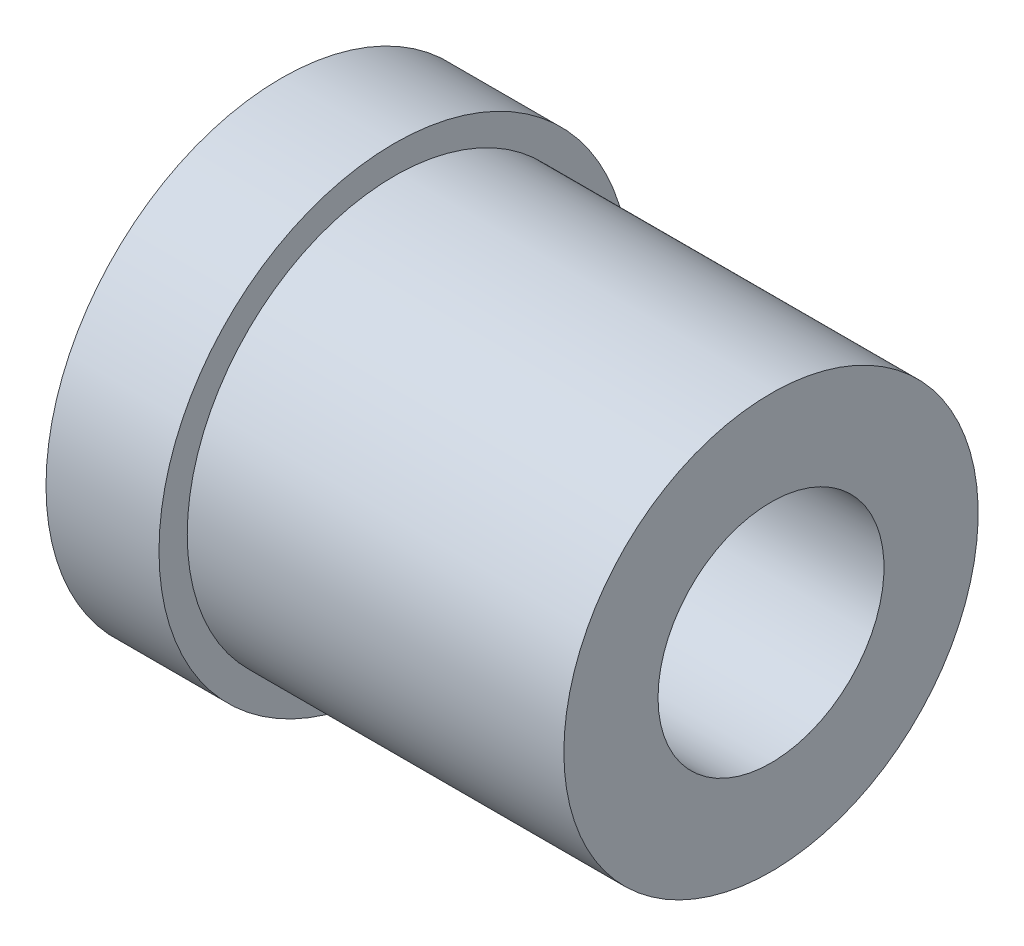
ISO-10303-21;
HEADER;
FILE_DESCRIPTION(('STEP AP214'),'2;1');
FILE_NAME('part.step','',(''),(''),'','','');
FILE_SCHEMA(('AUTOMOTIVE_DESIGN { 1 0 10303 214 1 1 1 1 }'));
ENDSEC;
DATA;
#1=APPLICATION_CONTEXT('core data for automotive mechanical design processes');
#2=APPLICATION_PROTOCOL_DEFINITION('international standard','automotive_design',2000,#1);
#3=PRODUCT_CONTEXT('',#1,'mechanical');
#4=PRODUCT('Part','Part','',(#3));
#5=PRODUCT_RELATED_PRODUCT_CATEGORY('part','',(#4));
#6=PRODUCT_DEFINITION_FORMATION('','',#4);
#7=PRODUCT_DEFINITION_CONTEXT('part definition',#1,'design');
#8=PRODUCT_DEFINITION('design','',#6,#7);
#9=PRODUCT_DEFINITION_SHAPE('','',#8);
#10=(LENGTH_UNIT() NAMED_UNIT(*) SI_UNIT(.MILLI.,.METRE.));
#11=(NAMED_UNIT(*) PLANE_ANGLE_UNIT() SI_UNIT($,.RADIAN.));
#12=(NAMED_UNIT(*) SI_UNIT($,.STERADIAN.) SOLID_ANGLE_UNIT());
#13=UNCERTAINTY_MEASURE_WITH_UNIT(LENGTH_MEASURE(1.E-05),#10,'distance_accuracy_value','');
#14=(GEOMETRIC_REPRESENTATION_CONTEXT(3) GLOBAL_UNCERTAINTY_ASSIGNED_CONTEXT((#13)) GLOBAL_UNIT_ASSIGNED_CONTEXT((#10,
#11,#12)) REPRESENTATION_CONTEXT('',''));
#15=CARTESIAN_POINT('',(0.,0.,0.));
#16=DIRECTION('',(0.,0.,1.));
#17=DIRECTION('',(1.,0.,0.));
#18=AXIS2_PLACEMENT_3D('',#15,#16,#17);
#19=CARTESIAN_POINT('',(0.,0.,0.));
#20=DIRECTION('',(-1.,0.,0.));
#21=DIRECTION('',(0.,0.,1.));
#22=AXIS2_PLACEMENT_3D('',#19,#20,#21);
#23=CYLINDRICAL_SURFACE('',#22,12.5);
#24=CARTESIAN_POINT('',(0.,0.,0.));
#25=DIRECTION('',(-1.,0.,0.));
#26=DIRECTION('',(0.,0.,1.));
#27=AXIS2_PLACEMENT_3D('',#24,#25,#26);
#28=CIRCLE('',#27,12.5);
#29=CARTESIAN_POINT('',(0.,0.,12.5));
#30=VERTEX_POINT('',#29);
#31=EDGE_CURVE('E12',#30,#30,#28,.T.);
#32=ORIENTED_EDGE('',*,*,#31,.F.);
#33=EDGE_LOOP('',(#32));
#34=FACE_BOUND('',#33,.T.);
#35=CARTESIAN_POINT('',(6.00000000000001,0.,0.));
#36=DIRECTION('',(-1.,0.,0.));
#37=DIRECTION('',(0.,0.,1.));
#38=AXIS2_PLACEMENT_3D('',#35,#36,#37);
#39=CIRCLE('',#38,12.5);
#40=CARTESIAN_POINT('',(6.00000000000001,0.,12.5));
#41=VERTEX_POINT('',#40);
#42=EDGE_CURVE('E64',#41,#41,#39,.T.);
#43=ORIENTED_EDGE('',*,*,#42,.T.);
#44=EDGE_LOOP('',(#43));
#45=FACE_BOUND('',#44,.T.);
#46=ADVANCED_FACE('F42',(#34,#45),#23,.T.);
#47=CARTESIAN_POINT('',(0.,12.5,0.));
#48=DIRECTION('',(1.,0.,0.));
#49=DIRECTION('',(0.,0.,-1.));
#50=AXIS2_PLACEMENT_3D('',#47,#48,#49);
#51=PLANE('',#50);
#52=CARTESIAN_POINT('',(0.,0.,0.));
#53=DIRECTION('',(-1.,0.,0.));
#54=DIRECTION('',(0.,0.,1.));
#55=AXIS2_PLACEMENT_3D('',#52,#53,#54);
#56=CIRCLE('',#55,6.);
#57=CARTESIAN_POINT('',(0.,0.,6.));
#58=VERTEX_POINT('',#57);
#59=EDGE_CURVE('E48',#58,#58,#56,.T.);
#60=ORIENTED_EDGE('',*,*,#59,.F.);
#61=EDGE_LOOP('',(#60));
#62=FACE_BOUND('',#61,.T.);
#63=ORIENTED_EDGE('',*,*,#31,.T.);
#64=EDGE_LOOP('',(#63));
#65=FACE_BOUND('',#64,.T.);
#66=ADVANCED_FACE('F89',(#62,#65),#51,.F.);
#67=CARTESIAN_POINT('',(0.,0.,0.));
#68=DIRECTION('',(-1.,0.,0.));
#69=DIRECTION('',(0.,0.,1.));
#70=AXIS2_PLACEMENT_3D('',#67,#68,#69);
#71=CYLINDRICAL_SURFACE('',#70,6.);
#72=CARTESIAN_POINT('',(26.,0.,0.));
#73=DIRECTION('',(-1.,0.,0.));
#74=DIRECTION('',(0.,0.,1.));
#75=AXIS2_PLACEMENT_3D('',#72,#73,#74);
#76=CIRCLE('',#75,6.);
#77=CARTESIAN_POINT('',(26.,0.,6.));
#78=VERTEX_POINT('',#77);
#79=EDGE_CURVE('E52',#78,#78,#76,.T.);
#80=ORIENTED_EDGE('',*,*,#79,.F.);
#81=EDGE_LOOP('',(#80));
#82=FACE_BOUND('',#81,.T.);
#83=ORIENTED_EDGE('',*,*,#59,.T.);
#84=EDGE_LOOP('',(#83));
#85=FACE_BOUND('',#84,.T.);
#86=ADVANCED_FACE('F84',(#82,#85),#71,.F.);
#87=CARTESIAN_POINT('',(26.,6.,0.));
#88=DIRECTION('',(-1.,0.,0.));
#89=DIRECTION('',(0.,0.,1.));
#90=AXIS2_PLACEMENT_3D('',#87,#88,#89);
#91=PLANE('',#90);
#92=CARTESIAN_POINT('',(26.,0.,0.));
#93=DIRECTION('',(-1.,0.,0.));
#94=DIRECTION('',(0.,0.,1.));
#95=AXIS2_PLACEMENT_3D('',#92,#93,#94);
#96=CIRCLE('',#95,11.);
#97=CARTESIAN_POINT('',(26.,0.,11.));
#98=VERTEX_POINT('',#97);
#99=EDGE_CURVE('E56',#98,#98,#96,.T.);
#100=ORIENTED_EDGE('',*,*,#99,.F.);
#101=EDGE_LOOP('',(#100));
#102=FACE_BOUND('',#101,.T.);
#103=ORIENTED_EDGE('',*,*,#79,.T.);
#104=EDGE_LOOP('',(#103));
#105=FACE_BOUND('',#104,.T.);
#106=ADVANCED_FACE('F78',(#102,#105),#91,.F.);
#107=CARTESIAN_POINT('',(0.,0.,0.));
#108=DIRECTION('',(-1.,0.,0.));
#109=DIRECTION('',(0.,0.,1.));
#110=AXIS2_PLACEMENT_3D('',#107,#108,#109);
#111=CYLINDRICAL_SURFACE('',#110,11.);
#112=CARTESIAN_POINT('',(6.00000000000001,0.,0.));
#113=DIRECTION('',(-1.,0.,0.));
#114=DIRECTION('',(0.,0.,1.));
#115=AXIS2_PLACEMENT_3D('',#112,#113,#114);
#116=CIRCLE('',#115,11.);
#117=CARTESIAN_POINT('',(6.00000000000001,0.,11.));
#118=VERTEX_POINT('',#117);
#119=EDGE_CURVE('E61',#118,#118,#116,.T.);
#120=ORIENTED_EDGE('',*,*,#119,.F.);
#121=EDGE_LOOP('',(#120));
#122=FACE_BOUND('',#121,.T.);
#123=ORIENTED_EDGE('',*,*,#99,.T.);
#124=EDGE_LOOP('',(#123));
#125=FACE_BOUND('',#124,.T.);
#126=ADVANCED_FACE('F72',(#122,#125),#111,.T.);
#127=CARTESIAN_POINT('',(6.00000000000001,11.,0.));
#128=DIRECTION('',(-1.,0.,0.));
#129=DIRECTION('',(0.,0.,1.));
#130=AXIS2_PLACEMENT_3D('',#127,#128,#129);
#131=PLANE('',#130);
#132=ORIENTED_EDGE('',*,*,#42,.F.);
#133=EDGE_LOOP('',(#132));
#134=FACE_BOUND('',#133,.T.);
#135=ORIENTED_EDGE('',*,*,#119,.T.);
#136=EDGE_LOOP('',(#135));
#137=FACE_BOUND('',#136,.T.);
#138=ADVANCED_FACE('F69',(#134,#137),#131,.F.);
#139=CLOSED_SHELL('',(#46,#66,#86,#106,#126,#138));
#140=MANIFOLD_SOLID_BREP('B2',#139);
#141=ADVANCED_BREP_SHAPE_REPRESENTATION('',(#18,#140),#14);
#142=SHAPE_DEFINITION_REPRESENTATION(#9,#141);
ENDSEC;
END-ISO-10303-21;
